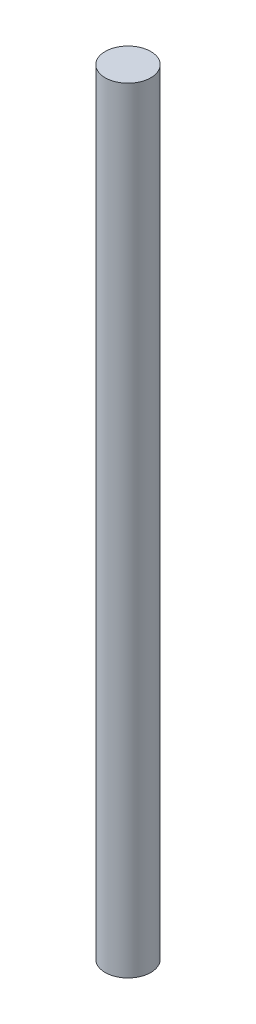
ISO-10303-21;
HEADER;
FILE_DESCRIPTION(('STEP AP214'),'2;1');
FILE_NAME('part.step','',(''),(''),'','','');
FILE_SCHEMA(('AUTOMOTIVE_DESIGN { 1 0 10303 214 1 1 1 1 }'));
ENDSEC;
DATA;
#1=APPLICATION_CONTEXT('core data for automotive mechanical design processes');
#2=APPLICATION_PROTOCOL_DEFINITION('international standard','automotive_design',2000,#1);
#3=PRODUCT_CONTEXT('',#1,'mechanical');
#4=PRODUCT('Part','Part','',(#3));
#5=PRODUCT_RELATED_PRODUCT_CATEGORY('part','',(#4));
#6=PRODUCT_DEFINITION_FORMATION('','',#4);
#7=PRODUCT_DEFINITION_CONTEXT('part definition',#1,'design');
#8=PRODUCT_DEFINITION('design','',#6,#7);
#9=PRODUCT_DEFINITION_SHAPE('','',#8);
#10=(LENGTH_UNIT() NAMED_UNIT(*) SI_UNIT(.MILLI.,.METRE.));
#11=(NAMED_UNIT(*) PLANE_ANGLE_UNIT() SI_UNIT($,.RADIAN.));
#12=(NAMED_UNIT(*) SI_UNIT($,.STERADIAN.) SOLID_ANGLE_UNIT());
#13=UNCERTAINTY_MEASURE_WITH_UNIT(LENGTH_MEASURE(1.E-05),#10,'distance_accuracy_value','');
#14=(GEOMETRIC_REPRESENTATION_CONTEXT(3) GLOBAL_UNCERTAINTY_ASSIGNED_CONTEXT((#13)) GLOBAL_UNIT_ASSIGNED_CONTEXT((#10,
#11,#12)) REPRESENTATION_CONTEXT('',''));
#15=CARTESIAN_POINT('',(0.,0.,0.));
#16=DIRECTION('',(0.,0.,1.));
#17=DIRECTION('',(1.,0.,0.));
#18=AXIS2_PLACEMENT_3D('',#15,#16,#17);
#19=CARTESIAN_POINT('',(-105.403121309485,340.,22.8645254668315));
#20=DIRECTION('',(0.,-1.,0.));
#21=DIRECTION('',(0.,0.,-1.));
#22=AXIS2_PLACEMENT_3D('',#19,#20,#21);
#23=CYLINDRICAL_SURFACE('',#22,10.);
#24=CARTESIAN_POINT('',(-105.403121309485,340.,22.8645254668315));
#25=DIRECTION('',(0.,1.,0.));
#26=DIRECTION('',(0.,0.,1.));
#27=AXIS2_PLACEMENT_3D('',#24,#25,#26);
#28=CIRCLE('',#27,10.);
#29=CARTESIAN_POINT('',(-105.403121309485,340.,32.8645254668315));
#30=VERTEX_POINT('',#29);
#31=EDGE_CURVE('E10',#30,#30,#28,.T.);
#32=ORIENTED_EDGE('',*,*,#31,.F.);
#33=EDGE_LOOP('',(#32));
#34=FACE_BOUND('',#33,.T.);
#35=CARTESIAN_POINT('',(-105.403121309485,0.,22.8645254668315));
#36=DIRECTION('',(0.,1.,0.));
#37=DIRECTION('',(0.,0.,1.));
#38=AXIS2_PLACEMENT_3D('',#35,#36,#37);
#39=CIRCLE('',#38,10.);
#40=CARTESIAN_POINT('',(-105.403121309485,0.,32.8645254668315));
#41=VERTEX_POINT('',#40);
#42=EDGE_CURVE('E40',#41,#41,#39,.T.);
#43=ORIENTED_EDGE('',*,*,#42,.T.);
#44=EDGE_LOOP('',(#43));
#45=FACE_BOUND('',#44,.T.);
#46=ADVANCED_FACE('F37',(#34,#45),#23,.T.);
#47=CARTESIAN_POINT('',(-105.403121309485,340.,22.8645254668315));
#48=DIRECTION('',(0.,1.,0.));
#49=DIRECTION('',(0.,0.,1.));
#50=AXIS2_PLACEMENT_3D('',#47,#48,#49);
#51=PLANE('',#50);
#52=ORIENTED_EDGE('',*,*,#31,.T.);
#53=EDGE_LOOP('',(#52));
#54=FACE_BOUND('',#53,.T.);
#55=ADVANCED_FACE('F54',(#54),#51,.T.);
#56=CARTESIAN_POINT('',(-105.403121309485,0.,22.8645254668315));
#57=DIRECTION('',(0.,1.,0.));
#58=DIRECTION('',(0.,0.,1.));
#59=AXIS2_PLACEMENT_3D('',#56,#57,#58);
#60=PLANE('',#59);
#61=ORIENTED_EDGE('',*,*,#42,.F.);
#62=EDGE_LOOP('',(#61));
#63=FACE_BOUND('',#62,.T.);
#64=ADVANCED_FACE('F52',(#63),#60,.F.);
#65=CLOSED_SHELL('',(#46,#55,#64));
#66=MANIFOLD_SOLID_BREP('B2',#65);
#67=ADVANCED_BREP_SHAPE_REPRESENTATION('',(#18,#66),#14);
#68=SHAPE_DEFINITION_REPRESENTATION(#9,#67);
ENDSEC;
END-ISO-10303-21;
